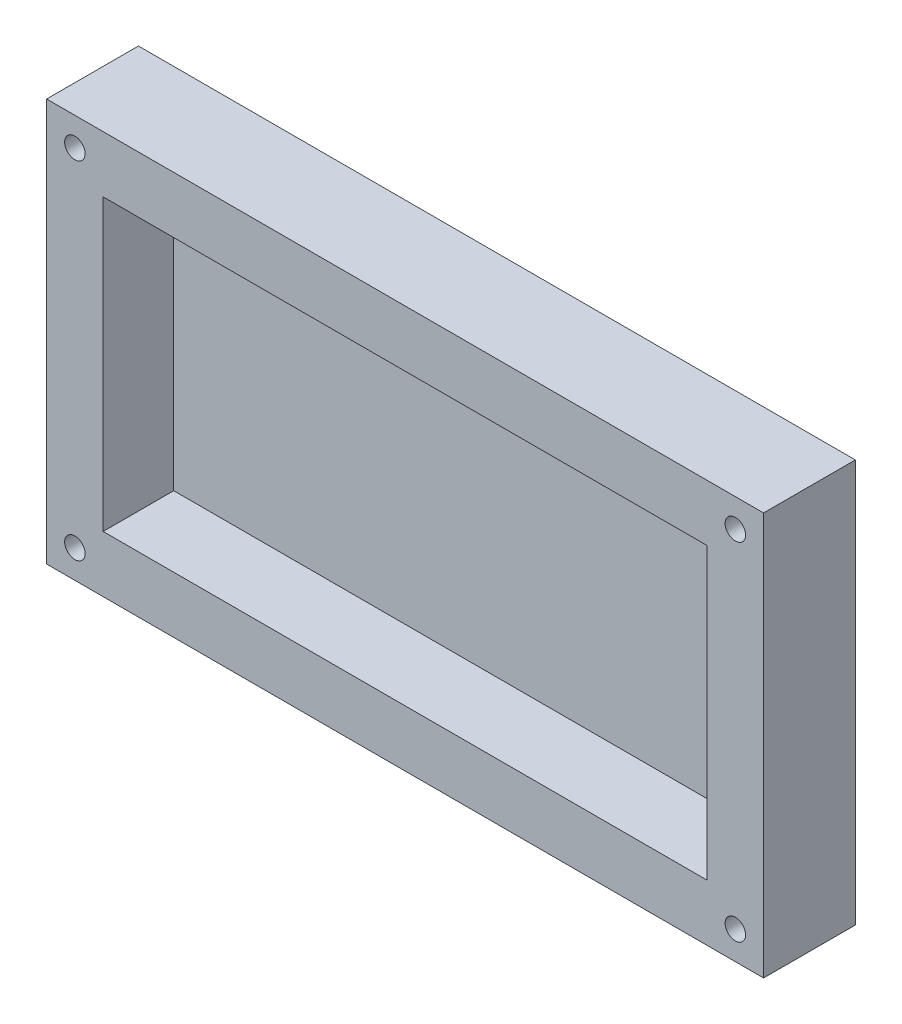
ISO-10303-21;
HEADER;
FILE_DESCRIPTION(('STEP AP214'),'2;1');
FILE_NAME('part.step','',(''),(''),'','','');
FILE_SCHEMA(('AUTOMOTIVE_DESIGN { 1 0 10303 214 1 1 1 1 }'));
ENDSEC;
DATA;
#1=APPLICATION_CONTEXT('core data for automotive mechanical design processes');
#2=APPLICATION_PROTOCOL_DEFINITION('international standard','automotive_design',2000,#1);
#3=PRODUCT_CONTEXT('',#1,'mechanical');
#4=PRODUCT('Part','Part','',(#3));
#5=PRODUCT_RELATED_PRODUCT_CATEGORY('part','',(#4));
#6=PRODUCT_DEFINITION_FORMATION('','',#4);
#7=PRODUCT_DEFINITION_CONTEXT('part definition',#1,'design');
#8=PRODUCT_DEFINITION('design','',#6,#7);
#9=PRODUCT_DEFINITION_SHAPE('','',#8);
#10=(LENGTH_UNIT() NAMED_UNIT(*) SI_UNIT(.MILLI.,.METRE.));
#11=(NAMED_UNIT(*) PLANE_ANGLE_UNIT() SI_UNIT($,.RADIAN.));
#12=(NAMED_UNIT(*) SI_UNIT($,.STERADIAN.) SOLID_ANGLE_UNIT());
#13=UNCERTAINTY_MEASURE_WITH_UNIT(LENGTH_MEASURE(1.E-05),#10,'distance_accuracy_value','');
#14=(GEOMETRIC_REPRESENTATION_CONTEXT(3) GLOBAL_UNCERTAINTY_ASSIGNED_CONTEXT((#13)) GLOBAL_UNIT_ASSIGNED_CONTEXT((#10,
#11,#12)) REPRESENTATION_CONTEXT('',''));
#15=CARTESIAN_POINT('',(0.,0.,0.));
#16=DIRECTION('',(0.,0.,1.));
#17=DIRECTION('',(1.,0.,0.));
#18=AXIS2_PLACEMENT_3D('',#15,#16,#17);
#19=CARTESIAN_POINT('',(-103.590732601131,-15.2724970202552,995.000000000007));
#20=DIRECTION('',(0.,1.,0.));
#21=DIRECTION('',(0.,0.,1.));
#22=AXIS2_PLACEMENT_3D('',#19,#20,#21);
#23=PLANE('',#22);
#24=DIRECTION('',(1.,0.,0.));
#25=VECTOR('',#24,1.);
#26=CARTESIAN_POINT('',(-103.590732601131,-15.2724970202552,992.000000000007));
#27=LINE('',#26,#25);
#28=CARTESIAN_POINT('',(-108.855313634726,-15.2724970202552,992.000000000007));
#29=VERTEX_POINT('',#28);
#30=CARTESIAN_POINT('',(-7.30531363472574,-15.2724970202552,992.000000000007));
#31=VERTEX_POINT('',#30);
#32=EDGE_CURVE('E165',#29,#31,#27,.T.);
#33=ORIENTED_EDGE('',*,*,#32,.T.);
#34=DIRECTION('',(0.,0.,-1.));
#35=VECTOR('',#34,1.);
#36=CARTESIAN_POINT('',(-7.30531363472574,-15.2724970202552,995.000000000007));
#37=LINE('',#36,#35);
#38=CARTESIAN_POINT('',(-7.30531363472574,-15.2724970202552,1005.00000000001));
#39=VERTEX_POINT('',#38);
#40=EDGE_CURVE('E173',#39,#31,#37,.T.);
#41=ORIENTED_EDGE('',*,*,#40,.F.);
#42=DIRECTION('',(1.,0.,0.));
#43=VECTOR('',#42,1.);
#44=CARTESIAN_POINT('',(-108.855313634726,-15.2724970202552,1005.00000000001));
#45=LINE('',#44,#43);
#46=CARTESIAN_POINT('',(-108.855313634726,-15.2724970202552,1005.00000000001));
#47=VERTEX_POINT('',#46);
#48=EDGE_CURVE('E141',#47,#39,#45,.T.);
#49=ORIENTED_EDGE('',*,*,#48,.F.);
#50=DIRECTION('',(0.,0.,-1.));
#51=VECTOR('',#50,1.);
#52=CARTESIAN_POINT('',(-108.855313634726,-15.2724970202552,995.000000000007));
#53=LINE('',#52,#51);
#54=EDGE_CURVE('E175',#47,#29,#53,.T.);
#55=ORIENTED_EDGE('',*,*,#54,.T.);
#56=EDGE_LOOP('',(#33,#41,#49,#55));
#57=FACE_BOUND('',#56,.T.);
#58=ADVANCED_FACE('F40',(#57),#23,.F.);
#59=CARTESIAN_POINT('',(-103.590732601131,20.8179936516987,995.000000000007));
#60=DIRECTION('',(0.,0.,1.));
#61=DIRECTION('',(1.,0.,0.));
#62=AXIS2_PLACEMENT_3D('',#59,#60,#61);
#63=PLANE('',#62);
#64=DIRECTION('',(0.,1.,0.));
#65=VECTOR('',#64,1.);
#66=CARTESIAN_POINT('',(-100.855313634726,20.8179936516987,995.000000000007));
#67=LINE('',#66,#65);
#68=CARTESIAN_POINT('',(-100.855313634726,-7.27249702025522,995.000000000007));
#69=VERTEX_POINT('',#68);
#70=CARTESIAN_POINT('',(-100.855313634726,33.7775029797448,995.000000000007));
#71=VERTEX_POINT('',#70);
#72=EDGE_CURVE('E11',#69,#71,#67,.T.);
#73=ORIENTED_EDGE('',*,*,#72,.F.);
#74=DIRECTION('',(-1.,0.,0.));
#75=VECTOR('',#74,1.);
#76=CARTESIAN_POINT('',(-103.590732601131,-7.27249702025522,995.000000000007));
#77=LINE('',#76,#75);
#78=CARTESIAN_POINT('',(-15.3053136347257,-7.27249702025522,995.000000000007));
#79=VERTEX_POINT('',#78);
#80=EDGE_CURVE('E48',#79,#69,#77,.T.);
#81=ORIENTED_EDGE('',*,*,#80,.F.);
#82=DIRECTION('',(0.,-1.,0.));
#83=VECTOR('',#82,1.);
#84=CARTESIAN_POINT('',(-15.3053136347257,20.8179936516987,995.000000000007));
#85=LINE('',#84,#83);
#86=CARTESIAN_POINT('',(-15.3053136347257,33.7775029797448,995.000000000007));
#87=VERTEX_POINT('',#86);
#88=EDGE_CURVE('E183',#87,#79,#85,.T.);
#89=ORIENTED_EDGE('',*,*,#88,.F.);
#90=DIRECTION('',(1.,0.,0.));
#91=VECTOR('',#90,1.);
#92=CARTESIAN_POINT('',(-103.590732601131,33.7775029797448,995.000000000007));
#93=LINE('',#92,#91);
#94=EDGE_CURVE('E180',#71,#87,#93,.T.);
#95=ORIENTED_EDGE('',*,*,#94,.F.);
#96=EDGE_LOOP('',(#73,#81,#89,#95));
#97=FACE_BOUND('',#96,.T.);
#98=ADVANCED_FACE('F186',(#97),#63,.T.);
#99=CARTESIAN_POINT('',(-104.855313634726,-11.2724970202552,995.000000000007));
#100=DIRECTION('',(0.,0.,-1.));
#101=DIRECTION('',(-1.,0.,0.));
#102=AXIS2_PLACEMENT_3D('',#99,#100,#101);
#103=CYLINDRICAL_SURFACE('',#102,1.45);
#104=CARTESIAN_POINT('',(-104.855313634726,-11.2724970202552,992.000000000007));
#105=DIRECTION('',(0.,0.,1.));
#106=DIRECTION('',(1.,0.,0.));
#107=AXIS2_PLACEMENT_3D('',#104,#105,#106);
#108=CIRCLE('',#107,1.45);
#109=CARTESIAN_POINT('',(-103.405313634726,-11.2724970202552,992.000000000007));
#110=VERTEX_POINT('',#109);
#111=EDGE_CURVE('E147',#110,#110,#108,.T.);
#112=ORIENTED_EDGE('',*,*,#111,.F.);
#113=EDGE_LOOP('',(#112));
#114=FACE_BOUND('',#113,.T.);
#115=CARTESIAN_POINT('',(-104.855313634726,-11.2724970202552,1005.00000000001));
#116=DIRECTION('',(0.,0.,1.));
#117=DIRECTION('',(1.,0.,0.));
#118=AXIS2_PLACEMENT_3D('',#115,#116,#117);
#119=CIRCLE('',#118,1.45);
#120=CARTESIAN_POINT('',(-103.405313634726,-11.2724970202552,1005.00000000001));
#121=VERTEX_POINT('',#120);
#122=EDGE_CURVE('E243',#121,#121,#119,.T.);
#123=ORIENTED_EDGE('',*,*,#122,.T.);
#124=EDGE_LOOP('',(#123));
#125=FACE_BOUND('',#124,.T.);
#126=ADVANCED_FACE('F42',(#114,#125),#103,.F.);
#127=CARTESIAN_POINT('',(-11.3053136347258,-11.2724970202552,995.000000000007));
#128=DIRECTION('',(0.,0.,-1.));
#129=DIRECTION('',(-1.,0.,0.));
#130=AXIS2_PLACEMENT_3D('',#127,#128,#129);
#131=CYLINDRICAL_SURFACE('',#130,1.45);
#132=CARTESIAN_POINT('',(-11.3053136347258,-11.2724970202552,992.000000000007));
#133=DIRECTION('',(0.,0.,1.));
#134=DIRECTION('',(1.,0.,0.));
#135=AXIS2_PLACEMENT_3D('',#132,#133,#134);
#136=CIRCLE('',#135,1.45);
#137=CARTESIAN_POINT('',(-9.85531363472576,-11.2724970202552,992.000000000007));
#138=VERTEX_POINT('',#137);
#139=EDGE_CURVE('E150',#138,#138,#136,.T.);
#140=ORIENTED_EDGE('',*,*,#139,.F.);
#141=EDGE_LOOP('',(#140));
#142=FACE_BOUND('',#141,.T.);
#143=CARTESIAN_POINT('',(-11.3053136347258,-11.2724970202552,1005.00000000001));
#144=DIRECTION('',(0.,0.,1.));
#145=DIRECTION('',(1.,0.,0.));
#146=AXIS2_PLACEMENT_3D('',#143,#144,#145);
#147=CIRCLE('',#146,1.45);
#148=CARTESIAN_POINT('',(-9.85531363472576,-11.2724970202552,1005.00000000001));
#149=VERTEX_POINT('',#148);
#150=EDGE_CURVE('E240',#149,#149,#147,.T.);
#151=ORIENTED_EDGE('',*,*,#150,.T.);
#152=EDGE_LOOP('',(#151));
#153=FACE_BOUND('',#152,.T.);
#154=ADVANCED_FACE('F204',(#142,#153),#131,.F.);
#155=CARTESIAN_POINT('',(-104.855313634726,37.7775029797448,995.000000000007));
#156=DIRECTION('',(0.,0.,-1.));
#157=DIRECTION('',(-1.,0.,0.));
#158=AXIS2_PLACEMENT_3D('',#155,#156,#157);
#159=CYLINDRICAL_SURFACE('',#158,1.45);
#160=CARTESIAN_POINT('',(-104.855313634726,37.7775029797448,992.000000000007));
#161=DIRECTION('',(0.,0.,1.));
#162=DIRECTION('',(1.,0.,0.));
#163=AXIS2_PLACEMENT_3D('',#160,#161,#162);
#164=CIRCLE('',#163,1.45);
#165=CARTESIAN_POINT('',(-103.405313634726,37.7775029797448,992.000000000007));
#166=VERTEX_POINT('',#165);
#167=EDGE_CURVE('E153',#166,#166,#164,.T.);
#168=ORIENTED_EDGE('',*,*,#167,.F.);
#169=EDGE_LOOP('',(#168));
#170=FACE_BOUND('',#169,.T.);
#171=CARTESIAN_POINT('',(-104.855313634726,37.7775029797448,1005.00000000001));
#172=DIRECTION('',(0.,0.,1.));
#173=DIRECTION('',(1.,0.,0.));
#174=AXIS2_PLACEMENT_3D('',#171,#172,#173);
#175=CIRCLE('',#174,1.45);
#176=CARTESIAN_POINT('',(-103.405313634726,37.7775029797448,1005.00000000001));
#177=VERTEX_POINT('',#176);
#178=EDGE_CURVE('E242',#177,#177,#175,.T.);
#179=ORIENTED_EDGE('',*,*,#178,.T.);
#180=EDGE_LOOP('',(#179));
#181=FACE_BOUND('',#180,.T.);
#182=ADVANCED_FACE('F228',(#170,#181),#159,.F.);
#183=CARTESIAN_POINT('',(-11.3053136347258,37.7775029797448,995.000000000007));
#184=DIRECTION('',(0.,0.,-1.));
#185=DIRECTION('',(-1.,0.,0.));
#186=AXIS2_PLACEMENT_3D('',#183,#184,#185);
#187=CYLINDRICAL_SURFACE('',#186,1.45);
#188=CARTESIAN_POINT('',(-11.3053136347258,37.7775029797448,992.000000000007));
#189=DIRECTION('',(0.,0.,1.));
#190=DIRECTION('',(1.,0.,0.));
#191=AXIS2_PLACEMENT_3D('',#188,#189,#190);
#192=CIRCLE('',#191,1.45);
#193=CARTESIAN_POINT('',(-9.85531363472575,37.7775029797448,992.000000000007));
#194=VERTEX_POINT('',#193);
#195=EDGE_CURVE('E156',#194,#194,#192,.T.);
#196=ORIENTED_EDGE('',*,*,#195,.F.);
#197=EDGE_LOOP('',(#196));
#198=FACE_BOUND('',#197,.T.);
#199=CARTESIAN_POINT('',(-11.3053136347258,37.7775029797448,1005.00000000001));
#200=DIRECTION('',(0.,0.,1.));
#201=DIRECTION('',(1.,0.,0.));
#202=AXIS2_PLACEMENT_3D('',#199,#200,#201);
#203=CIRCLE('',#202,1.45);
#204=CARTESIAN_POINT('',(-9.85531363472575,37.7775029797448,1005.00000000001));
#205=VERTEX_POINT('',#204);
#206=EDGE_CURVE('E111',#205,#205,#203,.T.);
#207=ORIENTED_EDGE('',*,*,#206,.T.);
#208=EDGE_LOOP('',(#207));
#209=FACE_BOUND('',#208,.T.);
#210=ADVANCED_FACE('F196',(#198,#209),#187,.F.);
#211=CARTESIAN_POINT('',(-15.3053136347257,33.7775029797448,1005.00000000001));
#212=DIRECTION('',(-1.,0.,0.));
#213=DIRECTION('',(0.,0.,1.));
#214=AXIS2_PLACEMENT_3D('',#211,#212,#213);
#215=PLANE('',#214);
#216=DIRECTION('',(0.,0.,-1.));
#217=VECTOR('',#216,1.);
#218=CARTESIAN_POINT('',(-15.3053136347257,33.7775029797448,1005.00000000001));
#219=LINE('',#218,#217);
#220=CARTESIAN_POINT('',(-15.3053136347257,33.7775029797448,1005.00000000001));
#221=VERTEX_POINT('',#220);
#222=EDGE_CURVE('E132',#221,#87,#219,.T.);
#223=ORIENTED_EDGE('',*,*,#222,.T.);
#224=ORIENTED_EDGE('',*,*,#88,.T.);
#225=DIRECTION('',(0.,0.,-1.));
#226=VECTOR('',#225,1.);
#227=CARTESIAN_POINT('',(-15.3053136347257,-7.27249702025522,1005.00000000001));
#228=LINE('',#227,#226);
#229=CARTESIAN_POINT('',(-15.3053136347257,-7.27249702025522,1005.00000000001));
#230=VERTEX_POINT('',#229);
#231=EDGE_CURVE('E118',#230,#79,#228,.T.);
#232=ORIENTED_EDGE('',*,*,#231,.F.);
#233=DIRECTION('',(0.,1.,0.));
#234=VECTOR('',#233,1.);
#235=CARTESIAN_POINT('',(-15.3053136347257,33.7775029797448,1005.00000000001));
#236=LINE('',#235,#234);
#237=EDGE_CURVE('E124',#230,#221,#236,.T.);
#238=ORIENTED_EDGE('',*,*,#237,.T.);
#239=EDGE_LOOP('',(#223,#224,#232,#238));
#240=FACE_BOUND('',#239,.T.);
#241=ADVANCED_FACE('F185',(#240),#215,.T.);
#242=CARTESIAN_POINT('',(-100.855313634726,33.7775029797448,1005.00000000001));
#243=DIRECTION('',(0.,-1.,0.));
#244=DIRECTION('',(0.,0.,-1.));
#245=AXIS2_PLACEMENT_3D('',#242,#243,#244);
#246=PLANE('',#245);
#247=DIRECTION('',(0.,0.,-1.));
#248=VECTOR('',#247,1.);
#249=CARTESIAN_POINT('',(-100.855313634726,33.7775029797448,1005.00000000001));
#250=LINE('',#249,#248);
#251=CARTESIAN_POINT('',(-100.855313634726,33.7775029797448,1005.00000000001));
#252=VERTEX_POINT('',#251);
#253=EDGE_CURVE('E106',#252,#71,#250,.T.);
#254=ORIENTED_EDGE('',*,*,#253,.T.);
#255=ORIENTED_EDGE('',*,*,#94,.T.);
#256=ORIENTED_EDGE('',*,*,#222,.F.);
#257=DIRECTION('',(-1.,0.,0.));
#258=VECTOR('',#257,1.);
#259=CARTESIAN_POINT('',(-100.855313634726,33.7775029797448,1005.00000000001));
#260=LINE('',#259,#258);
#261=EDGE_CURVE('E126',#221,#252,#260,.T.);
#262=ORIENTED_EDGE('',*,*,#261,.T.);
#263=EDGE_LOOP('',(#254,#255,#256,#262));
#264=FACE_BOUND('',#263,.T.);
#265=ADVANCED_FACE('F188',(#264),#246,.T.);
#266=CARTESIAN_POINT('',(-100.855313634726,33.7775029797448,1005.00000000001));
#267=DIRECTION('',(1.,0.,0.));
#268=DIRECTION('',(0.,1.,0.));
#269=AXIS2_PLACEMENT_3D('',#266,#267,#268);
#270=PLANE('',#269);
#271=DIRECTION('',(0.,0.,-1.));
#272=VECTOR('',#271,1.);
#273=CARTESIAN_POINT('',(-100.855313634726,-7.27249702025522,1005.00000000001));
#274=LINE('',#273,#272);
#275=CARTESIAN_POINT('',(-100.855313634726,-7.27249702025522,1005.00000000001));
#276=VERTEX_POINT('',#275);
#277=EDGE_CURVE('E104',#276,#69,#274,.T.);
#278=ORIENTED_EDGE('',*,*,#277,.T.);
#279=ORIENTED_EDGE('',*,*,#72,.T.);
#280=ORIENTED_EDGE('',*,*,#253,.F.);
#281=DIRECTION('',(0.,-1.,0.));
#282=VECTOR('',#281,1.);
#283=CARTESIAN_POINT('',(-100.855313634726,33.7775029797448,1005.00000000001));
#284=LINE('',#283,#282);
#285=EDGE_CURVE('E101',#252,#276,#284,.T.);
#286=ORIENTED_EDGE('',*,*,#285,.T.);
#287=EDGE_LOOP('',(#278,#279,#280,#286));
#288=FACE_BOUND('',#287,.T.);
#289=ADVANCED_FACE('F103',(#288),#270,.T.);
#290=CARTESIAN_POINT('',(-100.855313634726,-7.27249702025522,1005.00000000001));
#291=DIRECTION('',(0.,1.,0.));
#292=DIRECTION('',(0.,0.,1.));
#293=AXIS2_PLACEMENT_3D('',#290,#291,#292);
#294=PLANE('',#293);
#295=ORIENTED_EDGE('',*,*,#231,.T.);
#296=ORIENTED_EDGE('',*,*,#80,.T.);
#297=ORIENTED_EDGE('',*,*,#277,.F.);
#298=DIRECTION('',(1.,0.,0.));
#299=VECTOR('',#298,1.);
#300=CARTESIAN_POINT('',(-100.855313634726,-7.27249702025522,1005.00000000001));
#301=LINE('',#300,#299);
#302=EDGE_CURVE('E110',#276,#230,#301,.T.);
#303=ORIENTED_EDGE('',*,*,#302,.T.);
#304=EDGE_LOOP('',(#295,#296,#297,#303));
#305=FACE_BOUND('',#304,.T.);
#306=ADVANCED_FACE('F115',(#305),#294,.T.);
#307=CARTESIAN_POINT('',(-103.590732601131,20.8179936516987,1005.00000000001));
#308=DIRECTION('',(0.,0.,-1.));
#309=DIRECTION('',(-1.,0.,0.));
#310=AXIS2_PLACEMENT_3D('',#307,#308,#309);
#311=PLANE('',#310);
#312=ORIENTED_EDGE('',*,*,#302,.F.);
#313=ORIENTED_EDGE('',*,*,#285,.F.);
#314=ORIENTED_EDGE('',*,*,#261,.F.);
#315=ORIENTED_EDGE('',*,*,#237,.F.);
#316=EDGE_LOOP('',(#312,#313,#314,#315));
#317=FACE_BOUND('',#316,.T.);
#318=DIRECTION('',(-1.,0.,0.));
#319=VECTOR('',#318,1.);
#320=CARTESIAN_POINT('',(-108.855313634726,41.7775029797448,1005.00000000001));
#321=LINE('',#320,#319);
#322=CARTESIAN_POINT('',(-7.30531363472575,41.7775029797448,1005.00000000001));
#323=VERTEX_POINT('',#322);
#324=CARTESIAN_POINT('',(-108.855313634726,41.7775029797448,1005.00000000001));
#325=VERTEX_POINT('',#324);
#326=EDGE_CURVE('E117',#323,#325,#321,.T.);
#327=ORIENTED_EDGE('',*,*,#326,.T.);
#328=DIRECTION('',(0.,-1.,0.));
#329=VECTOR('',#328,1.);
#330=CARTESIAN_POINT('',(-108.855313634726,41.7775029797448,1005.00000000001));
#331=LINE('',#330,#329);
#332=EDGE_CURVE('E138',#325,#47,#331,.T.);
#333=ORIENTED_EDGE('',*,*,#332,.T.);
#334=ORIENTED_EDGE('',*,*,#48,.T.);
#335=DIRECTION('',(0.,1.,0.));
#336=VECTOR('',#335,1.);
#337=CARTESIAN_POINT('',(-7.30531363472575,41.7775029797448,1005.00000000001));
#338=LINE('',#337,#336);
#339=EDGE_CURVE('E144',#39,#323,#338,.T.);
#340=ORIENTED_EDGE('',*,*,#339,.T.);
#341=EDGE_LOOP('',(#327,#333,#334,#340));
#342=FACE_BOUND('',#341,.T.);
#343=ORIENTED_EDGE('',*,*,#206,.F.);
#344=EDGE_LOOP('',(#343));
#345=FACE_BOUND('',#344,.T.);
#346=ORIENTED_EDGE('',*,*,#178,.F.);
#347=EDGE_LOOP('',(#346));
#348=FACE_BOUND('',#347,.T.);
#349=ORIENTED_EDGE('',*,*,#150,.F.);
#350=EDGE_LOOP('',(#349));
#351=FACE_BOUND('',#350,.T.);
#352=ORIENTED_EDGE('',*,*,#122,.F.);
#353=EDGE_LOOP('',(#352));
#354=FACE_BOUND('',#353,.T.);
#355=ADVANCED_FACE('F121',(#317,#342,#345,#348,#351,#354),#311,.F.);
#356=CARTESIAN_POINT('',(-103.590732601131,20.8179936516987,992.000000000007));
#357=DIRECTION('',(0.,0.,1.));
#358=DIRECTION('',(1.,0.,0.));
#359=AXIS2_PLACEMENT_3D('',#356,#357,#358);
#360=PLANE('',#359);
#361=DIRECTION('',(1.,0.,0.));
#362=VECTOR('',#361,1.);
#363=CARTESIAN_POINT('',(-103.590732601131,41.7775029797448,992.000000000007));
#364=LINE('',#363,#362);
#365=CARTESIAN_POINT('',(-108.855313634726,41.7775029797448,992.000000000007));
#366=VERTEX_POINT('',#365);
#367=CARTESIAN_POINT('',(-7.30531363472575,41.7775029797448,992.000000000007));
#368=VERTEX_POINT('',#367);
#369=EDGE_CURVE('E159',#366,#368,#364,.T.);
#370=ORIENTED_EDGE('',*,*,#369,.T.);
#371=DIRECTION('',(0.,-1.,0.));
#372=VECTOR('',#371,1.);
#373=CARTESIAN_POINT('',(-7.30531363472575,20.8179936516988,992.000000000007));
#374=LINE('',#373,#372);
#375=EDGE_CURVE('E168',#368,#31,#374,.T.);
#376=ORIENTED_EDGE('',*,*,#375,.T.);
#377=ORIENTED_EDGE('',*,*,#32,.F.);
#378=DIRECTION('',(0.,-1.,0.));
#379=VECTOR('',#378,1.);
#380=CARTESIAN_POINT('',(-108.855313634726,20.8179936516987,992.000000000007));
#381=LINE('',#380,#379);
#382=EDGE_CURVE('E162',#366,#29,#381,.T.);
#383=ORIENTED_EDGE('',*,*,#382,.F.);
#384=EDGE_LOOP('',(#370,#376,#377,#383));
#385=FACE_BOUND('',#384,.T.);
#386=ORIENTED_EDGE('',*,*,#195,.T.);
#387=EDGE_LOOP('',(#386));
#388=FACE_BOUND('',#387,.T.);
#389=ORIENTED_EDGE('',*,*,#167,.T.);
#390=EDGE_LOOP('',(#389));
#391=FACE_BOUND('',#390,.T.);
#392=ORIENTED_EDGE('',*,*,#139,.T.);
#393=EDGE_LOOP('',(#392));
#394=FACE_BOUND('',#393,.T.);
#395=ORIENTED_EDGE('',*,*,#111,.T.);
#396=EDGE_LOOP('',(#395));
#397=FACE_BOUND('',#396,.T.);
#398=ADVANCED_FACE('F209',(#385,#388,#391,#394,#397),#360,.F.);
#399=CARTESIAN_POINT('',(-103.590732601131,41.7775029797448,995.000000000007));
#400=DIRECTION('',(0.,1.,0.));
#401=DIRECTION('',(0.,0.,1.));
#402=AXIS2_PLACEMENT_3D('',#399,#400,#401);
#403=PLANE('',#402);
#404=ORIENTED_EDGE('',*,*,#369,.F.);
#405=DIRECTION('',(0.,0.,-1.));
#406=VECTOR('',#405,1.);
#407=CARTESIAN_POINT('',(-108.855313634726,41.7775029797448,995.000000000007));
#408=LINE('',#407,#406);
#409=EDGE_CURVE('E178',#325,#366,#408,.T.);
#410=ORIENTED_EDGE('',*,*,#409,.F.);
#411=ORIENTED_EDGE('',*,*,#326,.F.);
#412=DIRECTION('',(0.,0.,-1.));
#413=VECTOR('',#412,1.);
#414=CARTESIAN_POINT('',(-7.30531363472575,41.7775029797448,995.000000000007));
#415=LINE('',#414,#413);
#416=EDGE_CURVE('E171',#323,#368,#415,.T.);
#417=ORIENTED_EDGE('',*,*,#416,.T.);
#418=EDGE_LOOP('',(#404,#410,#411,#417));
#419=FACE_BOUND('',#418,.T.);
#420=ADVANCED_FACE('F208',(#419),#403,.T.);
#421=CARTESIAN_POINT('',(-108.855313634726,20.8179936516987,995.000000000007));
#422=DIRECTION('',(1.,0.,0.));
#423=DIRECTION('',(0.,1.,0.));
#424=AXIS2_PLACEMENT_3D('',#421,#422,#423);
#425=PLANE('',#424);
#426=ORIENTED_EDGE('',*,*,#382,.T.);
#427=ORIENTED_EDGE('',*,*,#54,.F.);
#428=ORIENTED_EDGE('',*,*,#332,.F.);
#429=ORIENTED_EDGE('',*,*,#409,.T.);
#430=EDGE_LOOP('',(#426,#427,#428,#429));
#431=FACE_BOUND('',#430,.T.);
#432=ADVANCED_FACE('F217',(#431),#425,.F.);
#433=CARTESIAN_POINT('',(-7.30531363472575,20.8179936516988,995.000000000007));
#434=DIRECTION('',(1.,0.,0.));
#435=DIRECTION('',(0.,1.,0.));
#436=AXIS2_PLACEMENT_3D('',#433,#434,#435);
#437=PLANE('',#436);
#438=ORIENTED_EDGE('',*,*,#375,.F.);
#439=ORIENTED_EDGE('',*,*,#416,.F.);
#440=ORIENTED_EDGE('',*,*,#339,.F.);
#441=ORIENTED_EDGE('',*,*,#40,.T.);
#442=EDGE_LOOP('',(#438,#439,#440,#441));
#443=FACE_BOUND('',#442,.T.);
#444=ADVANCED_FACE('F215',(#443),#437,.T.);
#445=CLOSED_SHELL('',(#58,#98,#126,#154,#182,#210,#241,#265,#289,#306,#355,#398,#420,#432,#444));
#446=MANIFOLD_SOLID_BREP('B2',#445);
#447=ADVANCED_BREP_SHAPE_REPRESENTATION('',(#18,#446),#14);
#448=SHAPE_DEFINITION_REPRESENTATION(#9,#447);
ENDSEC;
END-ISO-10303-21;
